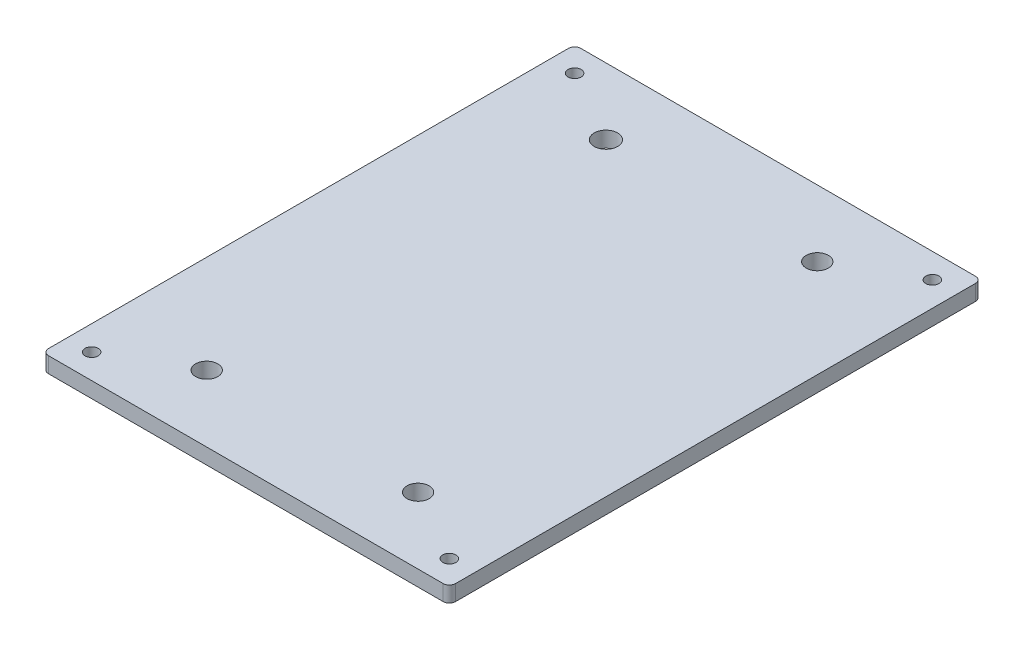
ISO-10303-21;
HEADER;
FILE_DESCRIPTION(('STEP AP214'),'2;1');
FILE_NAME('part.step','',(''),(''),'','','');
FILE_SCHEMA(('AUTOMOTIVE_DESIGN { 1 0 10303 214 1 1 1 1 }'));
ENDSEC;
DATA;
#1=APPLICATION_CONTEXT('core data for automotive mechanical design processes');
#2=APPLICATION_PROTOCOL_DEFINITION('international standard','automotive_design',2000,#1);
#3=PRODUCT_CONTEXT('',#1,'mechanical');
#4=PRODUCT('Part','Part','',(#3));
#5=PRODUCT_RELATED_PRODUCT_CATEGORY('part','',(#4));
#6=PRODUCT_DEFINITION_FORMATION('','',#4);
#7=PRODUCT_DEFINITION_CONTEXT('part definition',#1,'design');
#8=PRODUCT_DEFINITION('design','',#6,#7);
#9=PRODUCT_DEFINITION_SHAPE('','',#8);
#10=(LENGTH_UNIT() NAMED_UNIT(*) SI_UNIT(.MILLI.,.METRE.));
#11=(NAMED_UNIT(*) PLANE_ANGLE_UNIT() SI_UNIT($,.RADIAN.));
#12=(NAMED_UNIT(*) SI_UNIT($,.STERADIAN.) SOLID_ANGLE_UNIT());
#13=UNCERTAINTY_MEASURE_WITH_UNIT(LENGTH_MEASURE(1.E-05),#10,'distance_accuracy_value','');
#14=(GEOMETRIC_REPRESENTATION_CONTEXT(3) GLOBAL_UNCERTAINTY_ASSIGNED_CONTEXT((#13)) GLOBAL_UNIT_ASSIGNED_CONTEXT((#10,
#11,#12)) REPRESENTATION_CONTEXT('',''));
#15=CARTESIAN_POINT('',(0.,0.,0.));
#16=DIRECTION('',(0.,0.,1.));
#17=DIRECTION('',(1.,0.,0.));
#18=AXIS2_PLACEMENT_3D('',#15,#16,#17);
#19=CARTESIAN_POINT('',(-82.55,6.35,-107.95));
#20=DIRECTION('',(1.,0.,0.));
#21=DIRECTION('',(0.,0.,-1.));
#22=AXIS2_PLACEMENT_3D('',#19,#20,#21);
#23=PLANE('',#22);
#24=DIRECTION('',(0.,0.,1.));
#25=VECTOR('',#24,1.);
#26=CARTESIAN_POINT('',(-82.55,6.35,-107.95));
#27=LINE('',#26,#25);
#28=CARTESIAN_POINT('',(-82.55,6.35,-105.41));
#29=VERTEX_POINT('',#28);
#30=CARTESIAN_POINT('',(-82.55,6.35,105.41));
#31=VERTEX_POINT('',#30);
#32=EDGE_CURVE('E141',#29,#31,#27,.T.);
#33=ORIENTED_EDGE('',*,*,#32,.F.);
#34=DIRECTION('',(0.,-1.,0.));
#35=VECTOR('',#34,1.);
#36=CARTESIAN_POINT('',(-82.55,6.35,-105.41));
#37=LINE('',#36,#35);
#38=CARTESIAN_POINT('',(-82.55,0.,-105.41));
#39=VERTEX_POINT('',#38);
#40=EDGE_CURVE('E125',#29,#39,#37,.T.);
#41=ORIENTED_EDGE('',*,*,#40,.T.);
#42=DIRECTION('',(0.,0.,1.));
#43=VECTOR('',#42,1.);
#44=CARTESIAN_POINT('',(-82.55,0.,-107.95));
#45=LINE('',#44,#43);
#46=CARTESIAN_POINT('',(-82.55,0.,105.41));
#47=VERTEX_POINT('',#46);
#48=EDGE_CURVE('E138',#39,#47,#45,.T.);
#49=ORIENTED_EDGE('',*,*,#48,.T.);
#50=DIRECTION('',(0.,-1.,0.));
#51=VECTOR('',#50,1.);
#52=CARTESIAN_POINT('',(-82.55,6.35,105.41));
#53=LINE('',#52,#51);
#54=EDGE_CURVE('E144',#47,#31,#53,.F.);
#55=ORIENTED_EDGE('',*,*,#54,.T.);
#56=EDGE_LOOP('',(#33,#41,#49,#55));
#57=FACE_BOUND('',#56,.T.);
#58=ADVANCED_FACE('F43',(#57),#23,.F.);
#59=CARTESIAN_POINT('',(82.55,6.35,107.95));
#60=DIRECTION('',(0.,0.,-1.));
#61=DIRECTION('',(-1.,0.,0.));
#62=AXIS2_PLACEMENT_3D('',#59,#60,#61);
#63=PLANE('',#62);
#64=DIRECTION('',(1.,0.,0.));
#65=VECTOR('',#64,1.);
#66=CARTESIAN_POINT('',(82.55,0.,107.95));
#67=LINE('',#66,#65);
#68=CARTESIAN_POINT('',(-80.01,0.,107.95));
#69=VERTEX_POINT('',#68);
#70=CARTESIAN_POINT('',(80.01,0.,107.95));
#71=VERTEX_POINT('',#70);
#72=EDGE_CURVE('E149',#69,#71,#67,.T.);
#73=ORIENTED_EDGE('',*,*,#72,.T.);
#74=DIRECTION('',(0.,-1.,0.));
#75=VECTOR('',#74,1.);
#76=CARTESIAN_POINT('',(80.01,6.35,107.95));
#77=LINE('',#76,#75);
#78=CARTESIAN_POINT('',(80.01,6.35,107.95));
#79=VERTEX_POINT('',#78);
#80=EDGE_CURVE('E11',#71,#79,#77,.F.);
#81=ORIENTED_EDGE('',*,*,#80,.T.);
#82=DIRECTION('',(1.,0.,0.));
#83=VECTOR('',#82,1.);
#84=CARTESIAN_POINT('',(82.55,6.35,107.95));
#85=LINE('',#84,#83);
#86=CARTESIAN_POINT('',(-80.01,6.35,107.95));
#87=VERTEX_POINT('',#86);
#88=EDGE_CURVE('E206',#87,#79,#85,.T.);
#89=ORIENTED_EDGE('',*,*,#88,.F.);
#90=DIRECTION('',(0.,-1.,0.));
#91=VECTOR('',#90,1.);
#92=CARTESIAN_POINT('',(-80.01,6.35,107.95));
#93=LINE('',#92,#91);
#94=EDGE_CURVE('E52',#87,#69,#93,.T.);
#95=ORIENTED_EDGE('',*,*,#94,.T.);
#96=EDGE_LOOP('',(#73,#81,#89,#95));
#97=FACE_BOUND('',#96,.T.);
#98=ADVANCED_FACE('F204',(#97),#63,.F.);
#99=CARTESIAN_POINT('',(82.55,6.35,-107.95));
#100=DIRECTION('',(-1.,0.,0.));
#101=DIRECTION('',(0.,0.,1.));
#102=AXIS2_PLACEMENT_3D('',#99,#100,#101);
#103=PLANE('',#102);
#104=DIRECTION('',(0.,0.,-1.));
#105=VECTOR('',#104,1.);
#106=CARTESIAN_POINT('',(82.55,0.,-107.95));
#107=LINE('',#106,#105);
#108=CARTESIAN_POINT('',(82.55,0.,105.41));
#109=VERTEX_POINT('',#108);
#110=CARTESIAN_POINT('',(82.55,0.,-105.41));
#111=VERTEX_POINT('',#110);
#112=EDGE_CURVE('E155',#109,#111,#107,.T.);
#113=ORIENTED_EDGE('',*,*,#112,.T.);
#114=DIRECTION('',(0.,-1.,0.));
#115=VECTOR('',#114,1.);
#116=CARTESIAN_POINT('',(82.55,6.35,-105.41));
#117=LINE('',#116,#115);
#118=CARTESIAN_POINT('',(82.55,6.35,-105.41));
#119=VERTEX_POINT('',#118);
#120=EDGE_CURVE('E62',#111,#119,#117,.F.);
#121=ORIENTED_EDGE('',*,*,#120,.T.);
#122=DIRECTION('',(0.,0.,-1.));
#123=VECTOR('',#122,1.);
#124=CARTESIAN_POINT('',(82.55,6.35,-107.95));
#125=LINE('',#124,#123);
#126=CARTESIAN_POINT('',(82.55,6.35,105.41));
#127=VERTEX_POINT('',#126);
#128=EDGE_CURVE('E214',#127,#119,#125,.T.);
#129=ORIENTED_EDGE('',*,*,#128,.F.);
#130=DIRECTION('',(0.,-1.,0.));
#131=VECTOR('',#130,1.);
#132=CARTESIAN_POINT('',(82.55,6.35,105.41));
#133=LINE('',#132,#131);
#134=EDGE_CURVE('E194',#127,#109,#133,.T.);
#135=ORIENTED_EDGE('',*,*,#134,.T.);
#136=EDGE_LOOP('',(#113,#121,#129,#135));
#137=FACE_BOUND('',#136,.T.);
#138=ADVANCED_FACE('F213',(#137),#103,.F.);
#139=CARTESIAN_POINT('',(82.55,6.35,-107.95));
#140=DIRECTION('',(0.,0.,1.));
#141=DIRECTION('',(1.,0.,0.));
#142=AXIS2_PLACEMENT_3D('',#139,#140,#141);
#143=PLANE('',#142);
#144=DIRECTION('',(-1.,0.,0.));
#145=VECTOR('',#144,1.);
#146=CARTESIAN_POINT('',(82.55,0.,-107.95));
#147=LINE('',#146,#145);
#148=CARTESIAN_POINT('',(80.01,0.,-107.95));
#149=VERTEX_POINT('',#148);
#150=CARTESIAN_POINT('',(-80.01,0.,-107.95));
#151=VERTEX_POINT('',#150);
#152=EDGE_CURVE('E166',#149,#151,#147,.T.);
#153=ORIENTED_EDGE('',*,*,#152,.T.);
#154=DIRECTION('',(0.,-1.,0.));
#155=VECTOR('',#154,1.);
#156=CARTESIAN_POINT('',(-80.01,6.35,-107.95));
#157=LINE('',#156,#155);
#158=CARTESIAN_POINT('',(-80.01,6.35,-107.95));
#159=VERTEX_POINT('',#158);
#160=EDGE_CURVE('E126',#151,#159,#157,.F.);
#161=ORIENTED_EDGE('',*,*,#160,.T.);
#162=DIRECTION('',(-1.,0.,0.));
#163=VECTOR('',#162,1.);
#164=CARTESIAN_POINT('',(82.55,6.35,-107.95));
#165=LINE('',#164,#163);
#166=CARTESIAN_POINT('',(80.01,6.35,-107.95));
#167=VERTEX_POINT('',#166);
#168=EDGE_CURVE('E161',#167,#159,#165,.T.);
#169=ORIENTED_EDGE('',*,*,#168,.F.);
#170=DIRECTION('',(0.,-1.,0.));
#171=VECTOR('',#170,1.);
#172=CARTESIAN_POINT('',(80.01,6.35,-107.95));
#173=LINE('',#172,#171);
#174=EDGE_CURVE('E132',#167,#149,#173,.T.);
#175=ORIENTED_EDGE('',*,*,#174,.T.);
#176=EDGE_LOOP('',(#153,#161,#169,#175));
#177=FACE_BOUND('',#176,.T.);
#178=ADVANCED_FACE('F289',(#177),#143,.F.);
#179=CARTESIAN_POINT('',(0.,6.35,0.));
#180=DIRECTION('',(0.,-1.,0.));
#181=DIRECTION('',(0.,0.,-1.));
#182=AXIS2_PLACEMENT_3D('',#179,#180,#181);
#183=PLANE('',#182);
#184=CARTESIAN_POINT('',(42.8625,6.35,-80.9625));
#185=DIRECTION('',(0.,1.,0.));
#186=DIRECTION('',(0.,0.,1.));
#187=AXIS2_PLACEMENT_3D('',#184,#185,#186);
#188=CIRCLE('',#187,4.50000000000001);
#189=CARTESIAN_POINT('',(42.8625,6.35,-76.4625));
#190=VERTEX_POINT('',#189);
#191=EDGE_CURVE('E264',#190,#190,#188,.T.);
#192=ORIENTED_EDGE('',*,*,#191,.F.);
#193=EDGE_LOOP('',(#192));
#194=FACE_BOUND('',#193,.T.);
#195=CARTESIAN_POINT('',(42.8625,6.35,80.9625));
#196=DIRECTION('',(0.,1.,0.));
#197=DIRECTION('',(0.,0.,1.));
#198=AXIS2_PLACEMENT_3D('',#195,#196,#197);
#199=CIRCLE('',#198,4.5);
#200=CARTESIAN_POINT('',(42.8625,6.35,85.4625));
#201=VERTEX_POINT('',#200);
#202=EDGE_CURVE('E272',#201,#201,#199,.T.);
#203=ORIENTED_EDGE('',*,*,#202,.F.);
#204=EDGE_LOOP('',(#203));
#205=FACE_BOUND('',#204,.T.);
#206=CARTESIAN_POINT('',(-42.8625,6.35,80.9625));
#207=DIRECTION('',(0.,1.,0.));
#208=DIRECTION('',(0.,0.,1.));
#209=AXIS2_PLACEMENT_3D('',#206,#207,#208);
#210=CIRCLE('',#209,4.5);
#211=CARTESIAN_POINT('',(-42.8625,6.35,85.4625));
#212=VERTEX_POINT('',#211);
#213=EDGE_CURVE('E256',#212,#212,#210,.T.);
#214=ORIENTED_EDGE('',*,*,#213,.F.);
#215=EDGE_LOOP('',(#214));
#216=FACE_BOUND('',#215,.T.);
#217=CARTESIAN_POINT('',(-42.8625,6.35,-80.9625));
#218=DIRECTION('',(0.,1.,0.));
#219=DIRECTION('',(0.,0.,1.));
#220=AXIS2_PLACEMENT_3D('',#217,#218,#219);
#221=CIRCLE('',#220,4.7625);
#222=CARTESIAN_POINT('',(-42.8625,6.35,-76.2));
#223=VERTEX_POINT('',#222);
#224=EDGE_CURVE('E233',#223,#223,#221,.T.);
#225=ORIENTED_EDGE('',*,*,#224,.F.);
#226=EDGE_LOOP('',(#225));
#227=FACE_BOUND('',#226,.T.);
#228=CARTESIAN_POINT('',(-72.55,6.35,-97.95));
#229=DIRECTION('',(0.,1.,0.));
#230=DIRECTION('',(0.,0.,1.));
#231=AXIS2_PLACEMENT_3D('',#228,#229,#230);
#232=CIRCLE('',#231,2.665);
#233=CARTESIAN_POINT('',(-72.55,6.35,-95.285));
#234=VERTEX_POINT('',#233);
#235=EDGE_CURVE('E232',#234,#234,#232,.T.);
#236=ORIENTED_EDGE('',*,*,#235,.F.);
#237=EDGE_LOOP('',(#236));
#238=FACE_BOUND('',#237,.T.);
#239=CARTESIAN_POINT('',(72.55,6.35,-97.95));
#240=DIRECTION('',(0.,1.,0.));
#241=DIRECTION('',(0.,0.,1.));
#242=AXIS2_PLACEMENT_3D('',#239,#240,#241);
#243=CIRCLE('',#242,2.665);
#244=CARTESIAN_POINT('',(72.55,6.35,-95.285));
#245=VERTEX_POINT('',#244);
#246=EDGE_CURVE('E241',#245,#245,#243,.T.);
#247=ORIENTED_EDGE('',*,*,#246,.F.);
#248=EDGE_LOOP('',(#247));
#249=FACE_BOUND('',#248,.T.);
#250=CARTESIAN_POINT('',(72.55,6.35,97.95));
#251=DIRECTION('',(0.,1.,0.));
#252=DIRECTION('',(0.,0.,1.));
#253=AXIS2_PLACEMENT_3D('',#250,#251,#252);
#254=CIRCLE('',#253,2.665);
#255=CARTESIAN_POINT('',(72.55,6.35,100.615));
#256=VERTEX_POINT('',#255);
#257=EDGE_CURVE('E226',#256,#256,#254,.T.);
#258=ORIENTED_EDGE('',*,*,#257,.F.);
#259=EDGE_LOOP('',(#258));
#260=FACE_BOUND('',#259,.T.);
#261=CARTESIAN_POINT('',(-72.55,6.35,97.95));
#262=DIRECTION('',(0.,1.,0.));
#263=DIRECTION('',(0.,0.,1.));
#264=AXIS2_PLACEMENT_3D('',#261,#262,#263);
#265=CIRCLE('',#264,2.665);
#266=CARTESIAN_POINT('',(-72.55,6.35,100.615));
#267=VERTEX_POINT('',#266);
#268=EDGE_CURVE('E150',#267,#267,#265,.T.);
#269=ORIENTED_EDGE('',*,*,#268,.F.);
#270=EDGE_LOOP('',(#269));
#271=FACE_BOUND('',#270,.T.);
#272=ORIENTED_EDGE('',*,*,#168,.T.);
#273=CARTESIAN_POINT('',(-80.01,6.35,-105.41));
#274=DIRECTION('',(0.,-1.,0.));
#275=DIRECTION('',(0.,0.,-1.));
#276=AXIS2_PLACEMENT_3D('',#273,#274,#275);
#277=CIRCLE('',#276,2.54);
#278=EDGE_CURVE('E191',#159,#29,#277,.F.);
#279=ORIENTED_EDGE('',*,*,#278,.T.);
#280=ORIENTED_EDGE('',*,*,#32,.T.);
#281=CARTESIAN_POINT('',(-80.01,6.35,105.41));
#282=DIRECTION('',(0.,-1.,0.));
#283=DIRECTION('',(0.,0.,-1.));
#284=AXIS2_PLACEMENT_3D('',#281,#282,#283);
#285=CIRCLE('',#284,2.54);
#286=EDGE_CURVE('E183',#31,#87,#285,.F.);
#287=ORIENTED_EDGE('',*,*,#286,.T.);
#288=ORIENTED_EDGE('',*,*,#88,.T.);
#289=CARTESIAN_POINT('',(80.01,6.35,105.41));
#290=DIRECTION('',(0.,-1.,0.));
#291=DIRECTION('',(0.,0.,-1.));
#292=AXIS2_PLACEMENT_3D('',#289,#290,#291);
#293=CIRCLE('',#292,2.54);
#294=EDGE_CURVE('E71',#79,#127,#293,.F.);
#295=ORIENTED_EDGE('',*,*,#294,.T.);
#296=ORIENTED_EDGE('',*,*,#128,.T.);
#297=CARTESIAN_POINT('',(80.01,6.35,-105.41));
#298=DIRECTION('',(0.,-1.,0.));
#299=DIRECTION('',(0.,0.,-1.));
#300=AXIS2_PLACEMENT_3D('',#297,#298,#299);
#301=CIRCLE('',#300,2.54);
#302=EDGE_CURVE('E188',#119,#167,#301,.F.);
#303=ORIENTED_EDGE('',*,*,#302,.T.);
#304=EDGE_LOOP('',(#272,#279,#280,#287,#288,#295,#296,#303));
#305=FACE_BOUND('',#304,.T.);
#306=ADVANCED_FACE('F286',(#194,#205,#216,#227,#238,#249,#260,#271,#305),#183,.F.);
#307=CARTESIAN_POINT('',(0.,0.,0.));
#308=DIRECTION('',(0.,-1.,0.));
#309=DIRECTION('',(0.,0.,-1.));
#310=AXIS2_PLACEMENT_3D('',#307,#308,#309);
#311=PLANE('',#310);
#312=CARTESIAN_POINT('',(42.8625,0.,-80.9625));
#313=DIRECTION('',(0.,-1.,0.));
#314=DIRECTION('',(0.,0.,-1.));
#315=AXIS2_PLACEMENT_3D('',#312,#313,#314);
#316=CIRCLE('',#315,4.50000000000001);
#317=CARTESIAN_POINT('',(42.8625,0.,-85.4625));
#318=VERTEX_POINT('',#317);
#319=EDGE_CURVE('E260',#318,#318,#316,.F.);
#320=ORIENTED_EDGE('',*,*,#319,.T.);
#321=EDGE_LOOP('',(#320));
#322=FACE_BOUND('',#321,.T.);
#323=CARTESIAN_POINT('',(42.8625,0.,80.9625));
#324=DIRECTION('',(0.,-1.,0.));
#325=DIRECTION('',(0.,0.,-1.));
#326=AXIS2_PLACEMENT_3D('',#323,#324,#325);
#327=CIRCLE('',#326,4.5);
#328=CARTESIAN_POINT('',(42.8625,0.,76.4625));
#329=VERTEX_POINT('',#328);
#330=EDGE_CURVE('E268',#329,#329,#327,.F.);
#331=ORIENTED_EDGE('',*,*,#330,.T.);
#332=EDGE_LOOP('',(#331));
#333=FACE_BOUND('',#332,.T.);
#334=CARTESIAN_POINT('',(-42.8625,0.,80.9625));
#335=DIRECTION('',(0.,-1.,0.));
#336=DIRECTION('',(0.,0.,-1.));
#337=AXIS2_PLACEMENT_3D('',#334,#335,#336);
#338=CIRCLE('',#337,4.5);
#339=CARTESIAN_POINT('',(-42.8625,0.,76.4625));
#340=VERTEX_POINT('',#339);
#341=EDGE_CURVE('E276',#340,#340,#338,.F.);
#342=ORIENTED_EDGE('',*,*,#341,.T.);
#343=EDGE_LOOP('',(#342));
#344=FACE_BOUND('',#343,.T.);
#345=CARTESIAN_POINT('',(-42.8625,0.,-80.9625));
#346=DIRECTION('',(0.,-1.,0.));
#347=DIRECTION('',(0.,0.,-1.));
#348=AXIS2_PLACEMENT_3D('',#345,#346,#347);
#349=CIRCLE('',#348,4.7625);
#350=CARTESIAN_POINT('',(-42.8625,0.,-85.725));
#351=VERTEX_POINT('',#350);
#352=EDGE_CURVE('E252',#351,#351,#349,.F.);
#353=ORIENTED_EDGE('',*,*,#352,.T.);
#354=EDGE_LOOP('',(#353));
#355=FACE_BOUND('',#354,.T.);
#356=CARTESIAN_POINT('',(-72.55,0.,-97.95));
#357=DIRECTION('',(0.,-1.,0.));
#358=DIRECTION('',(0.,0.,-1.));
#359=AXIS2_PLACEMENT_3D('',#356,#357,#358);
#360=CIRCLE('',#359,2.665);
#361=CARTESIAN_POINT('',(-72.55,0.,-100.615));
#362=VERTEX_POINT('',#361);
#363=EDGE_CURVE('E228',#362,#362,#360,.F.);
#364=ORIENTED_EDGE('',*,*,#363,.T.);
#365=EDGE_LOOP('',(#364));
#366=FACE_BOUND('',#365,.T.);
#367=CARTESIAN_POINT('',(72.55,0.,-97.95));
#368=DIRECTION('',(0.,-1.,0.));
#369=DIRECTION('',(0.,0.,-1.));
#370=AXIS2_PLACEMENT_3D('',#367,#368,#369);
#371=CIRCLE('',#370,2.665);
#372=CARTESIAN_POINT('',(72.55,0.,-100.615));
#373=VERTEX_POINT('',#372);
#374=EDGE_CURVE('E237',#373,#373,#371,.F.);
#375=ORIENTED_EDGE('',*,*,#374,.T.);
#376=EDGE_LOOP('',(#375));
#377=FACE_BOUND('',#376,.T.);
#378=CARTESIAN_POINT('',(72.55,0.,97.95));
#379=DIRECTION('',(0.,-1.,0.));
#380=DIRECTION('',(0.,0.,-1.));
#381=AXIS2_PLACEMENT_3D('',#378,#379,#380);
#382=CIRCLE('',#381,2.665);
#383=CARTESIAN_POINT('',(72.55,0.,95.285));
#384=VERTEX_POINT('',#383);
#385=EDGE_CURVE('E245',#384,#384,#382,.F.);
#386=ORIENTED_EDGE('',*,*,#385,.T.);
#387=EDGE_LOOP('',(#386));
#388=FACE_BOUND('',#387,.T.);
#389=CARTESIAN_POINT('',(-72.55,0.,97.95));
#390=DIRECTION('',(0.,-1.,0.));
#391=DIRECTION('',(0.,0.,-1.));
#392=AXIS2_PLACEMENT_3D('',#389,#390,#391);
#393=CIRCLE('',#392,2.665);
#394=CARTESIAN_POINT('',(-72.55,0.,95.285));
#395=VERTEX_POINT('',#394);
#396=EDGE_CURVE('E158',#395,#395,#393,.F.);
#397=ORIENTED_EDGE('',*,*,#396,.T.);
#398=EDGE_LOOP('',(#397));
#399=FACE_BOUND('',#398,.T.);
#400=ORIENTED_EDGE('',*,*,#48,.F.);
#401=CARTESIAN_POINT('',(-80.01,0.,-105.41));
#402=DIRECTION('',(0.,-1.,0.));
#403=DIRECTION('',(0.,0.,-1.));
#404=AXIS2_PLACEMENT_3D('',#401,#402,#403);
#405=CIRCLE('',#404,2.54);
#406=EDGE_CURVE('E121',#39,#151,#405,.T.);
#407=ORIENTED_EDGE('',*,*,#406,.T.);
#408=ORIENTED_EDGE('',*,*,#152,.F.);
#409=CARTESIAN_POINT('',(80.01,0.,-105.41));
#410=DIRECTION('',(0.,-1.,0.));
#411=DIRECTION('',(0.,0.,-1.));
#412=AXIS2_PLACEMENT_3D('',#409,#410,#411);
#413=CIRCLE('',#412,2.54);
#414=EDGE_CURVE('E133',#149,#111,#413,.T.);
#415=ORIENTED_EDGE('',*,*,#414,.T.);
#416=ORIENTED_EDGE('',*,*,#112,.F.);
#417=CARTESIAN_POINT('',(80.01,0.,105.41));
#418=DIRECTION('',(0.,-1.,0.));
#419=DIRECTION('',(0.,0.,-1.));
#420=AXIS2_PLACEMENT_3D('',#417,#418,#419);
#421=CIRCLE('',#420,2.54);
#422=EDGE_CURVE('E173',#109,#71,#421,.T.);
#423=ORIENTED_EDGE('',*,*,#422,.T.);
#424=ORIENTED_EDGE('',*,*,#72,.F.);
#425=CARTESIAN_POINT('',(-80.01,0.,105.41));
#426=DIRECTION('',(0.,-1.,0.));
#427=DIRECTION('',(0.,0.,-1.));
#428=AXIS2_PLACEMENT_3D('',#425,#426,#427);
#429=CIRCLE('',#428,2.54);
#430=EDGE_CURVE('E143',#69,#47,#429,.T.);
#431=ORIENTED_EDGE('',*,*,#430,.T.);
#432=EDGE_LOOP('',(#400,#407,#408,#415,#416,#423,#424,#431));
#433=FACE_BOUND('',#432,.T.);
#434=ADVANCED_FACE('F146',(#322,#333,#344,#355,#366,#377,#388,#399,#433),#311,.T.);
#435=CARTESIAN_POINT('',(-72.55,-0.00100000000000013,97.95));
#436=DIRECTION('',(0.,1.,0.));
#437=DIRECTION('',(0.,0.,1.));
#438=AXIS2_PLACEMENT_3D('',#435,#436,#437);
#439=CYLINDRICAL_SURFACE('',#438,2.665);
#440=ORIENTED_EDGE('',*,*,#396,.F.);
#441=EDGE_LOOP('',(#440));
#442=FACE_BOUND('',#441,.T.);
#443=ORIENTED_EDGE('',*,*,#268,.T.);
#444=EDGE_LOOP('',(#443));
#445=FACE_BOUND('',#444,.T.);
#446=ADVANCED_FACE('F326',(#442,#445),#439,.F.);
#447=CARTESIAN_POINT('',(72.55,-0.00100000000000013,97.95));
#448=DIRECTION('',(0.,1.,0.));
#449=DIRECTION('',(0.,0.,1.));
#450=AXIS2_PLACEMENT_3D('',#447,#448,#449);
#451=CYLINDRICAL_SURFACE('',#450,2.665);
#452=ORIENTED_EDGE('',*,*,#385,.F.);
#453=EDGE_LOOP('',(#452));
#454=FACE_BOUND('',#453,.T.);
#455=ORIENTED_EDGE('',*,*,#257,.T.);
#456=EDGE_LOOP('',(#455));
#457=FACE_BOUND('',#456,.T.);
#458=ADVANCED_FACE('F331',(#454,#457),#451,.F.);
#459=CARTESIAN_POINT('',(72.55,-0.00100000000000013,-97.95));
#460=DIRECTION('',(0.,1.,0.));
#461=DIRECTION('',(0.,0.,1.));
#462=AXIS2_PLACEMENT_3D('',#459,#460,#461);
#463=CYLINDRICAL_SURFACE('',#462,2.665);
#464=ORIENTED_EDGE('',*,*,#374,.F.);
#465=EDGE_LOOP('',(#464));
#466=FACE_BOUND('',#465,.T.);
#467=ORIENTED_EDGE('',*,*,#246,.T.);
#468=EDGE_LOOP('',(#467));
#469=FACE_BOUND('',#468,.T.);
#470=ADVANCED_FACE('F335',(#466,#469),#463,.F.);
#471=CARTESIAN_POINT('',(-72.55,-0.00100000000000013,-97.95));
#472=DIRECTION('',(0.,1.,0.));
#473=DIRECTION('',(0.,0.,1.));
#474=AXIS2_PLACEMENT_3D('',#471,#472,#473);
#475=CYLINDRICAL_SURFACE('',#474,2.665);
#476=ORIENTED_EDGE('',*,*,#363,.F.);
#477=EDGE_LOOP('',(#476));
#478=FACE_BOUND('',#477,.T.);
#479=ORIENTED_EDGE('',*,*,#235,.T.);
#480=EDGE_LOOP('',(#479));
#481=FACE_BOUND('',#480,.T.);
#482=ADVANCED_FACE('F312',(#478,#481),#475,.F.);
#483=CARTESIAN_POINT('',(-80.01,6.35,-105.41));
#484=DIRECTION('',(0.,-1.,0.));
#485=DIRECTION('',(0.,0.,-1.));
#486=AXIS2_PLACEMENT_3D('',#483,#484,#485);
#487=CYLINDRICAL_SURFACE('',#486,2.54);
#488=ORIENTED_EDGE('',*,*,#278,.F.);
#489=ORIENTED_EDGE('',*,*,#160,.F.);
#490=ORIENTED_EDGE('',*,*,#406,.F.);
#491=ORIENTED_EDGE('',*,*,#40,.F.);
#492=EDGE_LOOP('',(#488,#489,#490,#491));
#493=FACE_BOUND('',#492,.T.);
#494=ADVANCED_FACE('F124',(#493),#487,.T.);
#495=CARTESIAN_POINT('',(80.01,6.35,-105.41));
#496=DIRECTION('',(0.,-1.,0.));
#497=DIRECTION('',(0.,0.,-1.));
#498=AXIS2_PLACEMENT_3D('',#495,#496,#497);
#499=CYLINDRICAL_SURFACE('',#498,2.54);
#500=ORIENTED_EDGE('',*,*,#302,.F.);
#501=ORIENTED_EDGE('',*,*,#120,.F.);
#502=ORIENTED_EDGE('',*,*,#414,.F.);
#503=ORIENTED_EDGE('',*,*,#174,.F.);
#504=EDGE_LOOP('',(#500,#501,#502,#503));
#505=FACE_BOUND('',#504,.T.);
#506=ADVANCED_FACE('F305',(#505),#499,.T.);
#507=CARTESIAN_POINT('',(80.01,6.35,105.41));
#508=DIRECTION('',(0.,-1.,0.));
#509=DIRECTION('',(0.,0.,-1.));
#510=AXIS2_PLACEMENT_3D('',#507,#508,#509);
#511=CYLINDRICAL_SURFACE('',#510,2.54);
#512=ORIENTED_EDGE('',*,*,#294,.F.);
#513=ORIENTED_EDGE('',*,*,#80,.F.);
#514=ORIENTED_EDGE('',*,*,#422,.F.);
#515=ORIENTED_EDGE('',*,*,#134,.F.);
#516=EDGE_LOOP('',(#512,#513,#514,#515));
#517=FACE_BOUND('',#516,.T.);
#518=ADVANCED_FACE('F212',(#517),#511,.T.);
#519=CARTESIAN_POINT('',(-80.01,6.35,105.41));
#520=DIRECTION('',(0.,-1.,0.));
#521=DIRECTION('',(0.,0.,-1.));
#522=AXIS2_PLACEMENT_3D('',#519,#520,#521);
#523=CYLINDRICAL_SURFACE('',#522,2.54);
#524=ORIENTED_EDGE('',*,*,#286,.F.);
#525=ORIENTED_EDGE('',*,*,#54,.F.);
#526=ORIENTED_EDGE('',*,*,#430,.F.);
#527=ORIENTED_EDGE('',*,*,#94,.F.);
#528=EDGE_LOOP('',(#524,#525,#526,#527));
#529=FACE_BOUND('',#528,.T.);
#530=ADVANCED_FACE('F45',(#529),#523,.T.);
#531=CARTESIAN_POINT('',(-42.8625,-0.00100000000000013,-80.9625));
#532=DIRECTION('',(0.,1.,0.));
#533=DIRECTION('',(0.,0.,1.));
#534=AXIS2_PLACEMENT_3D('',#531,#532,#533);
#535=CYLINDRICAL_SURFACE('',#534,4.7625);
#536=ORIENTED_EDGE('',*,*,#352,.F.);
#537=EDGE_LOOP('',(#536));
#538=FACE_BOUND('',#537,.T.);
#539=ORIENTED_EDGE('',*,*,#224,.T.);
#540=EDGE_LOOP('',(#539));
#541=FACE_BOUND('',#540,.T.);
#542=ADVANCED_FACE('F343',(#538,#541),#535,.F.);
#543=CARTESIAN_POINT('',(-42.8625,-0.00100000000000013,80.9625));
#544=DIRECTION('',(0.,1.,0.));
#545=DIRECTION('',(0.,0.,1.));
#546=AXIS2_PLACEMENT_3D('',#543,#544,#545);
#547=CYLINDRICAL_SURFACE('',#546,4.5);
#548=ORIENTED_EDGE('',*,*,#341,.F.);
#549=EDGE_LOOP('',(#548));
#550=FACE_BOUND('',#549,.T.);
#551=ORIENTED_EDGE('',*,*,#213,.T.);
#552=EDGE_LOOP('',(#551));
#553=FACE_BOUND('',#552,.T.);
#554=ADVANCED_FACE('F284',(#550,#553),#547,.F.);
#555=CARTESIAN_POINT('',(42.8625,-0.00100000000000013,80.9625));
#556=DIRECTION('',(0.,1.,0.));
#557=DIRECTION('',(0.,0.,1.));
#558=AXIS2_PLACEMENT_3D('',#555,#556,#557);
#559=CYLINDRICAL_SURFACE('',#558,4.5);
#560=ORIENTED_EDGE('',*,*,#330,.F.);
#561=EDGE_LOOP('',(#560));
#562=FACE_BOUND('',#561,.T.);
#563=ORIENTED_EDGE('',*,*,#202,.T.);
#564=EDGE_LOOP('',(#563));
#565=FACE_BOUND('',#564,.T.);
#566=ADVANCED_FACE('F350',(#562,#565),#559,.F.);
#567=CARTESIAN_POINT('',(42.8625,-0.00100000000000013,-80.9625));
#568=DIRECTION('',(0.,1.,0.));
#569=DIRECTION('',(0.,0.,1.));
#570=AXIS2_PLACEMENT_3D('',#567,#568,#569);
#571=CYLINDRICAL_SURFACE('',#570,4.50000000000001);
#572=ORIENTED_EDGE('',*,*,#319,.F.);
#573=EDGE_LOOP('',(#572));
#574=FACE_BOUND('',#573,.T.);
#575=ORIENTED_EDGE('',*,*,#191,.T.);
#576=EDGE_LOOP('',(#575));
#577=FACE_BOUND('',#576,.T.);
#578=ADVANCED_FACE('F347',(#574,#577),#571,.F.);
#579=CLOSED_SHELL('',(#58,#98,#138,#178,#306,#434,#446,#458,#470,#482,#494,#506,#518,#530,#542,
#554,#566,#578));
#580=MANIFOLD_SOLID_BREP('B2',#579);
#581=ADVANCED_BREP_SHAPE_REPRESENTATION('',(#18,#580),#14);
#582=SHAPE_DEFINITION_REPRESENTATION(#9,#581);
ENDSEC;
END-ISO-10303-21;
